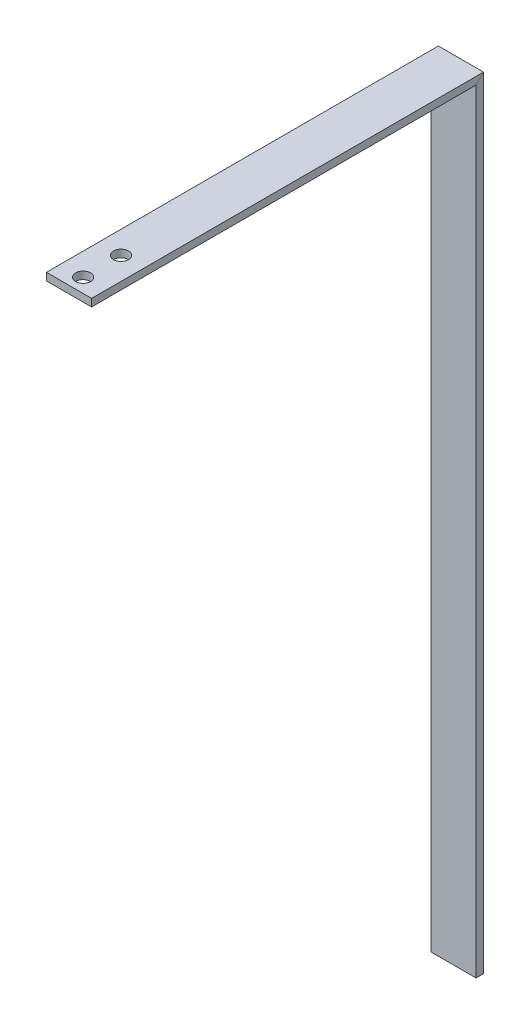
ISO-10303-21;
HEADER;
FILE_DESCRIPTION(('STEP AP214'),'2;1');
FILE_NAME('part.step','',(''),(''),'','','');
FILE_SCHEMA(('AUTOMOTIVE_DESIGN { 1 0 10303 214 1 1 1 1 }'));
ENDSEC;
DATA;
#1=APPLICATION_CONTEXT('core data for automotive mechanical design processes');
#2=APPLICATION_PROTOCOL_DEFINITION('international standard','automotive_design',2000,#1);
#3=PRODUCT_CONTEXT('',#1,'mechanical');
#4=PRODUCT('Part','Part','',(#3));
#5=PRODUCT_RELATED_PRODUCT_CATEGORY('part','',(#4));
#6=PRODUCT_DEFINITION_FORMATION('','',#4);
#7=PRODUCT_DEFINITION_CONTEXT('part definition',#1,'design');
#8=PRODUCT_DEFINITION('design','',#6,#7);
#9=PRODUCT_DEFINITION_SHAPE('','',#8);
#10=(LENGTH_UNIT() NAMED_UNIT(*) SI_UNIT(.MILLI.,.METRE.));
#11=(NAMED_UNIT(*) PLANE_ANGLE_UNIT() SI_UNIT($,.RADIAN.));
#12=(NAMED_UNIT(*) SI_UNIT($,.STERADIAN.) SOLID_ANGLE_UNIT());
#13=UNCERTAINTY_MEASURE_WITH_UNIT(LENGTH_MEASURE(1.E-05),#10,'distance_accuracy_value','');
#14=(GEOMETRIC_REPRESENTATION_CONTEXT(3) GLOBAL_UNCERTAINTY_ASSIGNED_CONTEXT((#13)) GLOBAL_UNIT_ASSIGNED_CONTEXT((#10,
#11,#12)) REPRESENTATION_CONTEXT('',''));
#15=CARTESIAN_POINT('',(0.,0.,0.));
#16=DIRECTION('',(0.,0.,1.));
#17=DIRECTION('',(1.,0.,0.));
#18=AXIS2_PLACEMENT_3D('',#15,#16,#17);
#19=CARTESIAN_POINT('',(19.05,425.25,6.31));
#20=DIRECTION('',(-1.,0.,0.));
#21=DIRECTION('',(0.,-1.,0.));
#22=AXIS2_PLACEMENT_3D('',#19,#20,#21);
#23=PLANE('',#22);
#24=DIRECTION('',(0.,0.,1.));
#25=VECTOR('',#24,1.);
#26=CARTESIAN_POINT('',(19.0500000000001,-268.786077720152,-571.69));
#27=LINE('',#26,#25);
#28=CARTESIAN_POINT('',(19.05,-268.786077720152,-202.8));
#29=VERTEX_POINT('',#28);
#30=CARTESIAN_POINT('',(19.05,-268.786077720152,-196.49));
#31=VERTEX_POINT('',#30);
#32=EDGE_CURVE('E45',#29,#31,#27,.T.);
#33=ORIENTED_EDGE('',*,*,#32,.F.);
#34=DIRECTION('',(0.,1.,0.));
#35=VECTOR('',#34,1.);
#36=CARTESIAN_POINT('',(19.0499999999999,-262.476077720152,-202.8));
#37=LINE('',#36,#35);
#38=CARTESIAN_POINT('',(19.0499999999999,390.008922279848,-202.8));
#39=VERTEX_POINT('',#38);
#40=EDGE_CURVE('E98',#29,#39,#37,.T.);
#41=ORIENTED_EDGE('',*,*,#40,.T.);
#42=DIRECTION('',(0.,-0.707106781186548,0.707106781186548));
#43=VECTOR('',#42,1.);
#44=CARTESIAN_POINT('',(19.0499999999999,60.6114222798484,126.5975));
#45=LINE('',#44,#43);
#46=CARTESIAN_POINT('',(19.0499999999999,383.698922279848,-196.49));
#47=VERTEX_POINT('',#46);
#48=EDGE_CURVE('E82',#39,#47,#45,.T.);
#49=ORIENTED_EDGE('',*,*,#48,.T.);
#50=DIRECTION('',(0.,1.,0.));
#51=VECTOR('',#50,1.);
#52=CARTESIAN_POINT('',(19.0499999999999,-262.476077720152,-196.49));
#53=LINE('',#52,#51);
#54=EDGE_CURVE('E107',#31,#47,#53,.T.);
#55=ORIENTED_EDGE('',*,*,#54,.F.);
#56=EDGE_LOOP('',(#33,#41,#49,#55));
#57=FACE_BOUND('',#56,.T.);
#58=ADVANCED_FACE('F37',(#57),#23,.F.);
#59=CARTESIAN_POINT('',(-19.0500000000001,425.25,6.31));
#60=DIRECTION('',(1.,0.,0.));
#61=DIRECTION('',(0.,1.,0.));
#62=AXIS2_PLACEMENT_3D('',#59,#60,#61);
#63=PLANE('',#62);
#64=DIRECTION('',(0.,1.,0.));
#65=VECTOR('',#64,1.);
#66=CARTESIAN_POINT('',(-19.0499999999999,-262.476077720152,-202.8));
#67=LINE('',#66,#65);
#68=CARTESIAN_POINT('',(-19.05,-268.786077720152,-202.8));
#69=VERTEX_POINT('',#68);
#70=CARTESIAN_POINT('',(-19.0499999999999,390.008922279848,-202.8));
#71=VERTEX_POINT('',#70);
#72=EDGE_CURVE('E106',#69,#71,#67,.T.);
#73=ORIENTED_EDGE('',*,*,#72,.F.);
#74=DIRECTION('',(0.,0.,1.));
#75=VECTOR('',#74,1.);
#76=CARTESIAN_POINT('',(-19.0499999999999,-268.786077720152,-571.69));
#77=LINE('',#76,#75);
#78=CARTESIAN_POINT('',(-19.0499999999999,-268.786077720152,-196.49));
#79=VERTEX_POINT('',#78);
#80=EDGE_CURVE('E113',#69,#79,#77,.T.);
#81=ORIENTED_EDGE('',*,*,#80,.T.);
#82=DIRECTION('',(0.,1.,0.));
#83=VECTOR('',#82,1.);
#84=CARTESIAN_POINT('',(-19.0499999999999,-262.476077720152,-196.49));
#85=LINE('',#84,#83);
#86=CARTESIAN_POINT('',(-19.0499999999999,383.698922279848,-196.49));
#87=VERTEX_POINT('',#86);
#88=EDGE_CURVE('E137',#79,#87,#85,.T.);
#89=ORIENTED_EDGE('',*,*,#88,.T.);
#90=DIRECTION('',(0.,0.707106781186548,-0.707106781186548));
#91=VECTOR('',#90,1.);
#92=CARTESIAN_POINT('',(-19.0499999999999,63.7664222798484,123.4425));
#93=LINE('',#92,#91);
#94=EDGE_CURVE('E144',#87,#71,#93,.T.);
#95=ORIENTED_EDGE('',*,*,#94,.T.);
#96=EDGE_LOOP('',(#73,#81,#89,#95));
#97=FACE_BOUND('',#96,.T.);
#98=ADVANCED_FACE('F191',(#97),#63,.F.);
#99=CARTESIAN_POINT('',(-19.0499999999999,-268.786077720152,-571.69));
#100=DIRECTION('',(0.,-1.,0.));
#101=DIRECTION('',(0.,0.,-1.));
#102=AXIS2_PLACEMENT_3D('',#99,#100,#101);
#103=PLANE('',#102);
#104=DIRECTION('',(1.,0.,0.));
#105=VECTOR('',#104,1.);
#106=CARTESIAN_POINT('',(-127.95,-268.786077720152,-202.8));
#107=LINE('',#106,#105);
#108=EDGE_CURVE('E102',#69,#29,#107,.T.);
#109=ORIENTED_EDGE('',*,*,#108,.T.);
#110=ORIENTED_EDGE('',*,*,#32,.T.);
#111=DIRECTION('',(1.,0.,0.));
#112=VECTOR('',#111,1.);
#113=CARTESIAN_POINT('',(-19.0499999999999,-268.786077720152,-196.49));
#114=LINE('',#113,#112);
#115=EDGE_CURVE('E11',#79,#31,#114,.T.);
#116=ORIENTED_EDGE('',*,*,#115,.F.);
#117=ORIENTED_EDGE('',*,*,#80,.F.);
#118=EDGE_LOOP('',(#109,#110,#116,#117));
#119=FACE_BOUND('',#118,.T.);
#120=ADVANCED_FACE('F110',(#119),#103,.T.);
#121=CARTESIAN_POINT('',(0.,187.208922279848,127.905));
#122=DIRECTION('',(0.,0.,1.));
#123=DIRECTION('',(0.,-1.,0.));
#124=AXIS2_PLACEMENT_3D('',#121,#122,#123);
#125=PLANE('',#124);
#126=DIRECTION('',(0.,1.,0.));
#127=VECTOR('',#126,1.);
#128=CARTESIAN_POINT('',(19.0499999999999,383.698922279848,127.905));
#129=LINE('',#128,#127);
#130=CARTESIAN_POINT('',(19.0499999999999,383.698922279848,127.905));
#131=VERTEX_POINT('',#130);
#132=CARTESIAN_POINT('',(19.0499999999999,390.008922279848,127.905));
#133=VERTEX_POINT('',#132);
#134=EDGE_CURVE('E71',#131,#133,#129,.T.);
#135=ORIENTED_EDGE('',*,*,#134,.T.);
#136=DIRECTION('',(-1.,0.,0.));
#137=VECTOR('',#136,1.);
#138=CARTESIAN_POINT('',(19.0499999999999,390.008922279848,127.905));
#139=LINE('',#138,#137);
#140=CARTESIAN_POINT('',(-19.0499999999999,390.008922279848,127.905));
#141=VERTEX_POINT('',#140);
#142=EDGE_CURVE('E130',#133,#141,#139,.T.);
#143=ORIENTED_EDGE('',*,*,#142,.T.);
#144=DIRECTION('',(0.,-1.,0.));
#145=VECTOR('',#144,1.);
#146=CARTESIAN_POINT('',(-19.0499999999999,390.008922279848,127.905));
#147=LINE('',#146,#145);
#148=CARTESIAN_POINT('',(-19.0499999999999,383.698922279848,127.905));
#149=VERTEX_POINT('',#148);
#150=EDGE_CURVE('E132',#141,#149,#147,.T.);
#151=ORIENTED_EDGE('',*,*,#150,.T.);
#152=DIRECTION('',(1.,0.,0.));
#153=VECTOR('',#152,1.);
#154=CARTESIAN_POINT('',(-19.0499999999999,383.698922279848,127.905));
#155=LINE('',#154,#153);
#156=EDGE_CURVE('E75',#149,#131,#155,.T.);
#157=ORIENTED_EDGE('',*,*,#156,.T.);
#158=EDGE_LOOP('',(#135,#143,#151,#157));
#159=FACE_BOUND('',#158,.T.);
#160=ADVANCED_FACE('F181',(#159),#125,.T.);
#161=CARTESIAN_POINT('',(19.0499999999999,383.698922279848,-203.2155));
#162=DIRECTION('',(1.,0.,0.));
#163=DIRECTION('',(0.,1.,0.));
#164=AXIS2_PLACEMENT_3D('',#161,#162,#163);
#165=PLANE('',#164);
#166=ORIENTED_EDGE('',*,*,#48,.F.);
#167=DIRECTION('',(0.,0.,1.));
#168=VECTOR('',#167,1.);
#169=CARTESIAN_POINT('',(19.0499999999999,390.008922279848,-203.2155));
#170=LINE('',#169,#168);
#171=EDGE_CURVE('E122',#39,#133,#170,.T.);
#172=ORIENTED_EDGE('',*,*,#171,.T.);
#173=ORIENTED_EDGE('',*,*,#134,.F.);
#174=DIRECTION('',(0.,0.,1.));
#175=VECTOR('',#174,1.);
#176=CARTESIAN_POINT('',(19.0499999999999,383.698922279848,-203.2155));
#177=LINE('',#176,#175);
#178=EDGE_CURVE('E119',#47,#131,#177,.T.);
#179=ORIENTED_EDGE('',*,*,#178,.F.);
#180=EDGE_LOOP('',(#166,#172,#173,#179));
#181=FACE_BOUND('',#180,.T.);
#182=ADVANCED_FACE('F174',(#181),#165,.T.);
#183=CARTESIAN_POINT('',(19.0499999999999,390.008922279848,-203.2155));
#184=DIRECTION('',(0.,1.,0.));
#185=DIRECTION('',(-1.,0.,0.));
#186=AXIS2_PLACEMENT_3D('',#183,#184,#185);
#187=PLANE('',#186);
#188=CARTESIAN_POINT('',(5.66422128936579E-12,390.008922279848,116.010000000762));
#189=DIRECTION('',(0.,1.,0.));
#190=DIRECTION('',(-1.,0.,0.));
#191=AXIS2_PLACEMENT_3D('',#188,#189,#190);
#192=CIRCLE('',#191,6.35000000000003);
#193=CARTESIAN_POINT('',(-6.34999999999436,390.008922279848,116.010000000762));
#194=VERTEX_POINT('',#193);
#195=EDGE_CURVE('E154',#194,#194,#192,.T.);
#196=ORIENTED_EDGE('',*,*,#195,.F.);
#197=EDGE_LOOP('',(#196));
#198=FACE_BOUND('',#197,.T.);
#199=CARTESIAN_POINT('',(5.55319898690327E-12,390.008922279848,84.0100000007622));
#200=DIRECTION('',(0.,1.,0.));
#201=DIRECTION('',(-1.,0.,0.));
#202=AXIS2_PLACEMENT_3D('',#199,#200,#201);
#203=CIRCLE('',#202,6.35000000000002);
#204=CARTESIAN_POINT('',(-6.34999999999447,390.008922279848,84.0100000007622));
#205=VERTEX_POINT('',#204);
#206=EDGE_CURVE('E148',#205,#205,#203,.T.);
#207=ORIENTED_EDGE('',*,*,#206,.F.);
#208=EDGE_LOOP('',(#207));
#209=FACE_BOUND('',#208,.T.);
#210=DIRECTION('',(1.,0.,0.));
#211=VECTOR('',#210,1.);
#212=CARTESIAN_POINT('',(19.05,390.008922279848,-202.8));
#213=LINE('',#212,#211);
#214=EDGE_CURVE('E53',#71,#39,#213,.T.);
#215=ORIENTED_EDGE('',*,*,#214,.F.);
#216=DIRECTION('',(0.,0.,1.));
#217=VECTOR('',#216,1.);
#218=CARTESIAN_POINT('',(-19.0499999999999,390.008922279848,-203.2155));
#219=LINE('',#218,#217);
#220=EDGE_CURVE('E124',#71,#141,#219,.T.);
#221=ORIENTED_EDGE('',*,*,#220,.T.);
#222=ORIENTED_EDGE('',*,*,#142,.F.);
#223=ORIENTED_EDGE('',*,*,#171,.F.);
#224=EDGE_LOOP('',(#215,#221,#222,#223));
#225=FACE_BOUND('',#224,.T.);
#226=ADVANCED_FACE('F170',(#198,#209,#225),#187,.T.);
#227=CARTESIAN_POINT('',(-19.0499999999999,390.008922279848,-203.2155));
#228=DIRECTION('',(-1.,0.,0.));
#229=DIRECTION('',(0.,-1.,0.));
#230=AXIS2_PLACEMENT_3D('',#227,#228,#229);
#231=PLANE('',#230);
#232=ORIENTED_EDGE('',*,*,#94,.F.);
#233=DIRECTION('',(0.,0.,1.));
#234=VECTOR('',#233,1.);
#235=CARTESIAN_POINT('',(-19.0499999999999,383.698922279848,-203.2155));
#236=LINE('',#235,#234);
#237=EDGE_CURVE('E126',#87,#149,#236,.T.);
#238=ORIENTED_EDGE('',*,*,#237,.T.);
#239=ORIENTED_EDGE('',*,*,#150,.F.);
#240=ORIENTED_EDGE('',*,*,#220,.F.);
#241=EDGE_LOOP('',(#232,#238,#239,#240));
#242=FACE_BOUND('',#241,.T.);
#243=ADVANCED_FACE('F173',(#242),#231,.T.);
#244=CARTESIAN_POINT('',(-19.0499999999999,383.698922279848,-203.2155));
#245=DIRECTION('',(0.,-1.,0.));
#246=DIRECTION('',(1.,0.,0.));
#247=AXIS2_PLACEMENT_3D('',#244,#245,#246);
#248=PLANE('',#247);
#249=CARTESIAN_POINT('',(5.66418615727626E-12,383.698922279848,116.010000000762));
#250=DIRECTION('',(0.,1.,0.));
#251=DIRECTION('',(-1.,0.,0.));
#252=AXIS2_PLACEMENT_3D('',#249,#250,#251);
#253=CIRCLE('',#252,6.35000000000003);
#254=CARTESIAN_POINT('',(-6.34999999999436,383.698922279848,116.010000000762));
#255=VERTEX_POINT('',#254);
#256=EDGE_CURVE('E151',#255,#255,#253,.T.);
#257=ORIENTED_EDGE('',*,*,#256,.T.);
#258=EDGE_LOOP('',(#257));
#259=FACE_BOUND('',#258,.T.);
#260=CARTESIAN_POINT('',(5.55316385481375E-12,383.698922279848,84.0100000007622));
#261=DIRECTION('',(0.,1.,0.));
#262=DIRECTION('',(-1.,0.,0.));
#263=AXIS2_PLACEMENT_3D('',#260,#261,#262);
#264=CIRCLE('',#263,6.35000000000002);
#265=CARTESIAN_POINT('',(-6.34999999999447,383.698922279848,84.0100000007622));
#266=VERTEX_POINT('',#265);
#267=EDGE_CURVE('E114',#266,#266,#264,.T.);
#268=ORIENTED_EDGE('',*,*,#267,.T.);
#269=EDGE_LOOP('',(#268));
#270=FACE_BOUND('',#269,.T.);
#271=DIRECTION('',(-1.,0.,0.));
#272=VECTOR('',#271,1.);
#273=CARTESIAN_POINT('',(-19.0499999999999,383.698922279848,-196.49));
#274=LINE('',#273,#272);
#275=EDGE_CURVE('E136',#47,#87,#274,.T.);
#276=ORIENTED_EDGE('',*,*,#275,.F.);
#277=ORIENTED_EDGE('',*,*,#178,.T.);
#278=ORIENTED_EDGE('',*,*,#156,.F.);
#279=ORIENTED_EDGE('',*,*,#237,.F.);
#280=EDGE_LOOP('',(#276,#277,#278,#279));
#281=FACE_BOUND('',#280,.T.);
#282=ADVANCED_FACE('F160',(#259,#270,#281),#248,.T.);
#283=CARTESIAN_POINT('',(-19.0499999999999,-262.476077720152,-196.49));
#284=DIRECTION('',(0.,0.,1.));
#285=DIRECTION('',(0.,-1.,0.));
#286=AXIS2_PLACEMENT_3D('',#283,#284,#285);
#287=PLANE('',#286);
#288=ORIENTED_EDGE('',*,*,#54,.T.);
#289=ORIENTED_EDGE('',*,*,#275,.T.);
#290=ORIENTED_EDGE('',*,*,#88,.F.);
#291=ORIENTED_EDGE('',*,*,#115,.T.);
#292=EDGE_LOOP('',(#288,#289,#290,#291));
#293=FACE_BOUND('',#292,.T.);
#294=ADVANCED_FACE('F185',(#293),#287,.T.);
#295=CARTESIAN_POINT('',(19.0499999999999,-262.476077720152,-202.8));
#296=DIRECTION('',(0.,0.,-1.));
#297=DIRECTION('',(0.,1.,0.));
#298=AXIS2_PLACEMENT_3D('',#295,#296,#297);
#299=PLANE('',#298);
#300=ORIENTED_EDGE('',*,*,#72,.T.);
#301=ORIENTED_EDGE('',*,*,#214,.T.);
#302=ORIENTED_EDGE('',*,*,#40,.F.);
#303=ORIENTED_EDGE('',*,*,#108,.F.);
#304=EDGE_LOOP('',(#300,#301,#302,#303));
#305=FACE_BOUND('',#304,.T.);
#306=ADVANCED_FACE('F101',(#305),#299,.T.);
#307=CARTESIAN_POINT('',(5.55316385481375E-12,383.698922279848,84.0100000007622));
#308=DIRECTION('',(0.,1.,0.));
#309=DIRECTION('',(-1.,0.,0.));
#310=AXIS2_PLACEMENT_3D('',#307,#308,#309);
#311=CYLINDRICAL_SURFACE('',#310,6.35000000000002);
#312=ORIENTED_EDGE('',*,*,#267,.F.);
#313=EDGE_LOOP('',(#312));
#314=FACE_BOUND('',#313,.T.);
#315=ORIENTED_EDGE('',*,*,#206,.T.);
#316=EDGE_LOOP('',(#315));
#317=FACE_BOUND('',#316,.T.);
#318=ADVANCED_FACE('F166',(#314,#317),#311,.F.);
#319=CARTESIAN_POINT('',(5.66418615727626E-12,383.698922279848,116.010000000762));
#320=DIRECTION('',(0.,1.,0.));
#321=DIRECTION('',(-1.,0.,0.));
#322=AXIS2_PLACEMENT_3D('',#319,#320,#321);
#323=CYLINDRICAL_SURFACE('',#322,6.35000000000003);
#324=ORIENTED_EDGE('',*,*,#256,.F.);
#325=EDGE_LOOP('',(#324));
#326=FACE_BOUND('',#325,.T.);
#327=ORIENTED_EDGE('',*,*,#195,.T.);
#328=EDGE_LOOP('',(#327));
#329=FACE_BOUND('',#328,.T.);
#330=ADVANCED_FACE('F163',(#326,#329),#323,.F.);
#331=CLOSED_SHELL('',(#58,#98,#120,#160,#182,#226,#243,#282,#294,#306,#318,#330));
#332=MANIFOLD_SOLID_BREP('B2',#331);
#333=ADVANCED_BREP_SHAPE_REPRESENTATION('',(#18,#332),#14);
#334=SHAPE_DEFINITION_REPRESENTATION(#9,#333);
ENDSEC;
END-ISO-10303-21;
